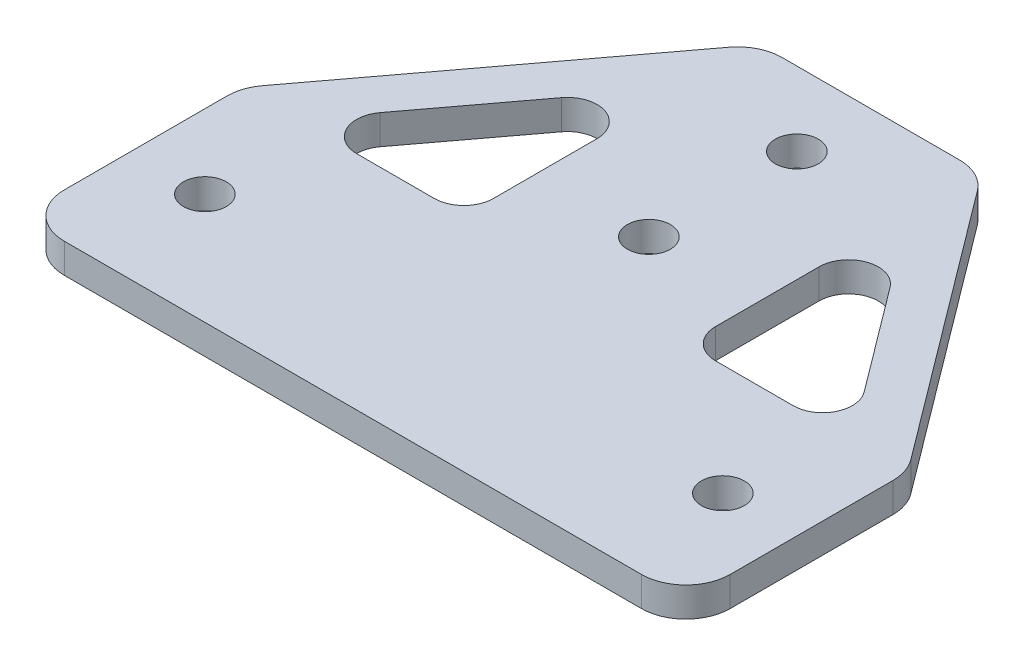
ISO-10303-21;
HEADER;
FILE_DESCRIPTION(('STEP AP214'),'2;1');
FILE_NAME('part.step','',(''),(''),'','','');
FILE_SCHEMA(('AUTOMOTIVE_DESIGN { 1 0 10303 214 1 1 1 1 }'));
ENDSEC;
DATA;
#1=APPLICATION_CONTEXT('core data for automotive mechanical design processes');
#2=APPLICATION_PROTOCOL_DEFINITION('international standard','automotive_design',2000,#1);
#3=PRODUCT_CONTEXT('',#1,'mechanical');
#4=PRODUCT('Part','Part','',(#3));
#5=PRODUCT_RELATED_PRODUCT_CATEGORY('part','',(#4));
#6=PRODUCT_DEFINITION_FORMATION('','',#4);
#7=PRODUCT_DEFINITION_CONTEXT('part definition',#1,'design');
#8=PRODUCT_DEFINITION('design','',#6,#7);
#9=PRODUCT_DEFINITION_SHAPE('','',#8);
#10=(LENGTH_UNIT() NAMED_UNIT(*) SI_UNIT(.MILLI.,.METRE.));
#11=(NAMED_UNIT(*) PLANE_ANGLE_UNIT() SI_UNIT($,.RADIAN.));
#12=(NAMED_UNIT(*) SI_UNIT($,.STERADIAN.) SOLID_ANGLE_UNIT());
#13=UNCERTAINTY_MEASURE_WITH_UNIT(LENGTH_MEASURE(1.E-05),#10,'distance_accuracy_value','');
#14=(GEOMETRIC_REPRESENTATION_CONTEXT(3) GLOBAL_UNCERTAINTY_ASSIGNED_CONTEXT((#13)) GLOBAL_UNIT_ASSIGNED_CONTEXT((#10,
#11,#12)) REPRESENTATION_CONTEXT('',''));
#15=CARTESIAN_POINT('',(0.,0.,0.));
#16=DIRECTION('',(0.,0.,1.));
#17=DIRECTION('',(1.,0.,0.));
#18=AXIS2_PLACEMENT_3D('',#15,#16,#17);
#19=CARTESIAN_POINT('',(0.,2.,0.));
#20=DIRECTION('',(0.,1.,0.));
#21=DIRECTION('',(0.,0.,1.));
#22=AXIS2_PLACEMENT_3D('',#19,#20,#21);
#23=PLANE('',#22);
#24=CARTESIAN_POINT('',(0.,2.,-12.5));
#25=DIRECTION('',(0.,1.,0.));
#26=DIRECTION('',(0.,0.,1.));
#27=AXIS2_PLACEMENT_3D('',#24,#25,#26);
#28=CIRCLE('',#27,1.45);
#29=CARTESIAN_POINT('',(0.,2.,-11.05));
#30=VERTEX_POINT('',#29);
#31=EDGE_CURVE('E386',#30,#30,#28,.T.);
#32=ORIENTED_EDGE('',*,*,#31,.F.);
#33=EDGE_LOOP('',(#32));
#34=FACE_BOUND('',#33,.T.);
#35=CARTESIAN_POINT('',(-17.5,2.,0.));
#36=DIRECTION('',(0.,1.,0.));
#37=DIRECTION('',(0.,0.,1.));
#38=AXIS2_PLACEMENT_3D('',#35,#36,#37);
#39=CIRCLE('',#38,1.45);
#40=CARTESIAN_POINT('',(-17.5,2.,1.45));
#41=VERTEX_POINT('',#40);
#42=EDGE_CURVE('E231',#41,#41,#39,.T.);
#43=ORIENTED_EDGE('',*,*,#42,.F.);
#44=EDGE_LOOP('',(#43));
#45=FACE_BOUND('',#44,.T.);
#46=DIRECTION('',(0.,0.,-1.));
#47=VECTOR('',#46,1.);
#48=CARTESIAN_POINT('',(22.5,2.,7.5));
#49=LINE('',#48,#47);
#50=CARTESIAN_POINT('',(22.5,2.,4.5));
#51=VERTEX_POINT('',#50);
#52=CARTESIAN_POINT('',(22.5,2.,-6.5));
#53=VERTEX_POINT('',#52);
#54=EDGE_CURVE('E240',#51,#53,#49,.T.);
#55=ORIENTED_EDGE('',*,*,#54,.T.);
#56=CARTESIAN_POINT('',(19.5,2.,-6.5));
#57=DIRECTION('',(0.,1.,0.));
#58=DIRECTION('',(0.,0.,1.));
#59=AXIS2_PLACEMENT_3D('',#56,#57,#58);
#60=CIRCLE('',#59,3.);
#61=CARTESIAN_POINT('',(21.9,2.,-8.3));
#62=VERTEX_POINT('',#61);
#63=EDGE_CURVE('E275',#53,#62,#60,.T.);
#64=ORIENTED_EDGE('',*,*,#63,.T.);
#65=DIRECTION('',(-0.6,0.,-0.8));
#66=VECTOR('',#65,1.);
#67=CARTESIAN_POINT('',(22.5,2.,-7.5));
#68=LINE('',#67,#66);
#69=CARTESIAN_POINT('',(8.40000000000001,2.,-26.3));
#70=VERTEX_POINT('',#69);
#71=EDGE_CURVE('E223',#62,#70,#68,.T.);
#72=ORIENTED_EDGE('',*,*,#71,.T.);
#73=CARTESIAN_POINT('',(6.00000000000001,2.,-24.5));
#74=DIRECTION('',(0.,1.,0.));
#75=DIRECTION('',(0.,0.,1.));
#76=AXIS2_PLACEMENT_3D('',#73,#74,#75);
#77=CIRCLE('',#76,3.);
#78=CARTESIAN_POINT('',(6.00000000000001,2.,-27.5));
#79=VERTEX_POINT('',#78);
#80=EDGE_CURVE('E265',#70,#79,#77,.T.);
#81=ORIENTED_EDGE('',*,*,#80,.T.);
#82=DIRECTION('',(-1.,0.,0.));
#83=VECTOR('',#82,1.);
#84=CARTESIAN_POINT('',(7.50000000000001,2.,-27.5));
#85=LINE('',#84,#83);
#86=CARTESIAN_POINT('',(-6.,2.,-27.5));
#87=VERTEX_POINT('',#86);
#88=EDGE_CURVE('E400',#79,#87,#85,.T.);
#89=ORIENTED_EDGE('',*,*,#88,.T.);
#90=CARTESIAN_POINT('',(-6.,2.,-24.5));
#91=DIRECTION('',(0.,1.,0.));
#92=DIRECTION('',(0.,0.,1.));
#93=AXIS2_PLACEMENT_3D('',#90,#91,#92);
#94=CIRCLE('',#93,3.);
#95=CARTESIAN_POINT('',(-8.4,2.,-26.3));
#96=VERTEX_POINT('',#95);
#97=EDGE_CURVE('E267',#87,#96,#94,.T.);
#98=ORIENTED_EDGE('',*,*,#97,.T.);
#99=DIRECTION('',(-0.6,0.,0.8));
#100=VECTOR('',#99,1.);
#101=CARTESIAN_POINT('',(-7.5,2.,-27.5));
#102=LINE('',#101,#100);
#103=CARTESIAN_POINT('',(-21.9,2.,-8.3));
#104=VERTEX_POINT('',#103);
#105=EDGE_CURVE('E403',#96,#104,#102,.T.);
#106=ORIENTED_EDGE('',*,*,#105,.T.);
#107=CARTESIAN_POINT('',(-19.5,2.,-6.5));
#108=DIRECTION('',(0.,1.,0.));
#109=DIRECTION('',(0.,0.,1.));
#110=AXIS2_PLACEMENT_3D('',#107,#108,#109);
#111=CIRCLE('',#110,3.);
#112=CARTESIAN_POINT('',(-22.5,2.,-6.5));
#113=VERTEX_POINT('',#112);
#114=EDGE_CURVE('E269',#104,#113,#111,.T.);
#115=ORIENTED_EDGE('',*,*,#114,.T.);
#116=DIRECTION('',(0.,0.,1.));
#117=VECTOR('',#116,1.);
#118=CARTESIAN_POINT('',(-22.5,2.,-7.5));
#119=LINE('',#118,#117);
#120=CARTESIAN_POINT('',(-22.5,2.,4.5));
#121=VERTEX_POINT('',#120);
#122=EDGE_CURVE('E406',#113,#121,#119,.T.);
#123=ORIENTED_EDGE('',*,*,#122,.T.);
#124=CARTESIAN_POINT('',(-19.5,2.,4.5));
#125=DIRECTION('',(0.,1.,0.));
#126=DIRECTION('',(0.,0.,1.));
#127=AXIS2_PLACEMENT_3D('',#124,#125,#126);
#128=CIRCLE('',#127,3.);
#129=CARTESIAN_POINT('',(-19.5,2.,7.5));
#130=VERTEX_POINT('',#129);
#131=EDGE_CURVE('E271',#121,#130,#128,.T.);
#132=ORIENTED_EDGE('',*,*,#131,.T.);
#133=DIRECTION('',(1.,0.,0.));
#134=VECTOR('',#133,1.);
#135=CARTESIAN_POINT('',(-22.5,2.,7.5));
#136=LINE('',#135,#134);
#137=CARTESIAN_POINT('',(19.5,2.,7.5));
#138=VERTEX_POINT('',#137);
#139=EDGE_CURVE('E408',#130,#138,#136,.T.);
#140=ORIENTED_EDGE('',*,*,#139,.T.);
#141=CARTESIAN_POINT('',(19.5,2.,4.5));
#142=DIRECTION('',(0.,1.,0.));
#143=DIRECTION('',(0.,0.,1.));
#144=AXIS2_PLACEMENT_3D('',#141,#142,#143);
#145=CIRCLE('',#144,3.);
#146=EDGE_CURVE('E273',#138,#51,#145,.T.);
#147=ORIENTED_EDGE('',*,*,#146,.T.);
#148=EDGE_LOOP('',(#55,#64,#72,#81,#89,#98,#106,#115,#123,#132,#140,#147));
#149=FACE_BOUND('',#148,.T.);
#150=CARTESIAN_POINT('',(17.5,2.,0.));
#151=DIRECTION('',(0.,1.,0.));
#152=DIRECTION('',(0.,0.,1.));
#153=AXIS2_PLACEMENT_3D('',#150,#151,#152);
#154=CIRCLE('',#153,1.45);
#155=CARTESIAN_POINT('',(17.5,2.,1.45));
#156=VERTEX_POINT('',#155);
#157=EDGE_CURVE('E392',#156,#156,#154,.T.);
#158=ORIENTED_EDGE('',*,*,#157,.F.);
#159=EDGE_LOOP('',(#158));
#160=FACE_BOUND('',#159,.T.);
#161=CARTESIAN_POINT('',(0.,2.,-22.5));
#162=DIRECTION('',(0.,1.,0.));
#163=DIRECTION('',(0.,0.,1.));
#164=AXIS2_PLACEMENT_3D('',#161,#162,#163);
#165=CIRCLE('',#164,1.45);
#166=CARTESIAN_POINT('',(0.,2.,-21.05));
#167=VERTEX_POINT('',#166);
#168=EDGE_CURVE('E380',#167,#167,#165,.T.);
#169=ORIENTED_EDGE('',*,*,#168,.F.);
#170=EDGE_LOOP('',(#169));
#171=FACE_BOUND('',#170,.T.);
#172=DIRECTION('',(-0.6,0.,0.8));
#173=VECTOR('',#172,1.);
#174=CARTESIAN_POINT('',(-7.5,2.,-22.5));
#175=LINE('',#174,#173);
#176=CARTESIAN_POINT('',(-11.1,2.,-17.7));
#177=VERTEX_POINT('',#176);
#178=CARTESIAN_POINT('',(-16.35,2.,-10.7));
#179=VERTEX_POINT('',#178);
#180=EDGE_CURVE('E363',#177,#179,#175,.T.);
#181=ORIENTED_EDGE('',*,*,#180,.F.);
#182=CARTESIAN_POINT('',(-9.5,2.,-16.5));
#183=DIRECTION('',(0.,1.,0.));
#184=DIRECTION('',(0.,0.,1.));
#185=AXIS2_PLACEMENT_3D('',#182,#183,#184);
#186=CIRCLE('',#185,2.);
#187=CARTESIAN_POINT('',(-7.5,2.,-16.5));
#188=VERTEX_POINT('',#187);
#189=EDGE_CURVE('E11',#177,#188,#186,.F.);
#190=ORIENTED_EDGE('',*,*,#189,.T.);
#191=DIRECTION('',(0.,0.,-1.));
#192=VECTOR('',#191,1.);
#193=CARTESIAN_POINT('',(-7.5,2.,-7.5));
#194=LINE('',#193,#192);
#195=CARTESIAN_POINT('',(-7.5,2.,-9.5));
#196=VERTEX_POINT('',#195);
#197=EDGE_CURVE('E361',#196,#188,#194,.T.);
#198=ORIENTED_EDGE('',*,*,#197,.F.);
#199=CARTESIAN_POINT('',(-9.5,2.,-9.5));
#200=DIRECTION('',(0.,1.,0.));
#201=DIRECTION('',(0.,0.,1.));
#202=AXIS2_PLACEMENT_3D('',#199,#200,#201);
#203=CIRCLE('',#202,2.);
#204=CARTESIAN_POINT('',(-9.5,2.,-7.5));
#205=VERTEX_POINT('',#204);
#206=EDGE_CURVE('E340',#196,#205,#203,.F.);
#207=ORIENTED_EDGE('',*,*,#206,.T.);
#208=DIRECTION('',(1.,0.,0.));
#209=VECTOR('',#208,1.);
#210=CARTESIAN_POINT('',(-18.75,2.,-7.5));
#211=LINE('',#210,#209);
#212=CARTESIAN_POINT('',(-14.75,2.,-7.5));
#213=VERTEX_POINT('',#212);
#214=EDGE_CURVE('E368',#213,#205,#211,.T.);
#215=ORIENTED_EDGE('',*,*,#214,.F.);
#216=CARTESIAN_POINT('',(-14.75,2.,-9.5));
#217=DIRECTION('',(0.,1.,0.));
#218=DIRECTION('',(0.,0.,1.));
#219=AXIS2_PLACEMENT_3D('',#216,#217,#218);
#220=CIRCLE('',#219,2.);
#221=EDGE_CURVE('E56',#213,#179,#220,.F.);
#222=ORIENTED_EDGE('',*,*,#221,.T.);
#223=EDGE_LOOP('',(#181,#190,#198,#207,#215,#222));
#224=FACE_BOUND('',#223,.T.);
#225=DIRECTION('',(0.,0.,1.));
#226=VECTOR('',#225,1.);
#227=CARTESIAN_POINT('',(7.50000000000001,2.,-7.5));
#228=LINE('',#227,#226);
#229=CARTESIAN_POINT('',(7.5,2.,-16.5));
#230=VERTEX_POINT('',#229);
#231=CARTESIAN_POINT('',(7.50000000000001,2.,-9.5));
#232=VERTEX_POINT('',#231);
#233=EDGE_CURVE('E621',#230,#232,#228,.T.);
#234=ORIENTED_EDGE('',*,*,#233,.F.);
#235=CARTESIAN_POINT('',(9.5,2.,-16.5));
#236=DIRECTION('',(0.,1.,0.));
#237=DIRECTION('',(0.,0.,1.));
#238=AXIS2_PLACEMENT_3D('',#235,#236,#237);
#239=CIRCLE('',#238,2.);
#240=CARTESIAN_POINT('',(11.1,2.,-17.7));
#241=VERTEX_POINT('',#240);
#242=EDGE_CURVE('E336',#230,#241,#239,.F.);
#243=ORIENTED_EDGE('',*,*,#242,.T.);
#244=DIRECTION('',(-0.6,0.,-0.8));
#245=VECTOR('',#244,1.);
#246=CARTESIAN_POINT('',(7.5,2.,-22.5));
#247=LINE('',#246,#245);
#248=CARTESIAN_POINT('',(16.35,2.,-10.7));
#249=VERTEX_POINT('',#248);
#250=EDGE_CURVE('E618',#249,#241,#247,.T.);
#251=ORIENTED_EDGE('',*,*,#250,.F.);
#252=CARTESIAN_POINT('',(14.75,2.,-9.5));
#253=DIRECTION('',(0.,1.,0.));
#254=DIRECTION('',(0.,0.,1.));
#255=AXIS2_PLACEMENT_3D('',#252,#253,#254);
#256=CIRCLE('',#255,2.);
#257=CARTESIAN_POINT('',(14.75,2.,-7.5));
#258=VERTEX_POINT('',#257);
#259=EDGE_CURVE('E332',#249,#258,#256,.F.);
#260=ORIENTED_EDGE('',*,*,#259,.T.);
#261=DIRECTION('',(1.,0.,0.));
#262=VECTOR('',#261,1.);
#263=CARTESIAN_POINT('',(18.75,2.,-7.5));
#264=LINE('',#263,#262);
#265=CARTESIAN_POINT('',(9.50000000000001,2.,-7.5));
#266=VERTEX_POINT('',#265);
#267=EDGE_CURVE('E378',#266,#258,#264,.T.);
#268=ORIENTED_EDGE('',*,*,#267,.F.);
#269=CARTESIAN_POINT('',(9.50000000000001,2.,-9.5));
#270=DIRECTION('',(0.,1.,0.));
#271=DIRECTION('',(0.,0.,1.));
#272=AXIS2_PLACEMENT_3D('',#269,#270,#271);
#273=CIRCLE('',#272,2.);
#274=EDGE_CURVE('E328',#266,#232,#273,.F.);
#275=ORIENTED_EDGE('',*,*,#274,.T.);
#276=EDGE_LOOP('',(#234,#243,#251,#260,#268,#275));
#277=FACE_BOUND('',#276,.T.);
#278=ADVANCED_FACE('F41',(#34,#45,#149,#160,#171,#224,#277),#23,.T.);
#279=CARTESIAN_POINT('',(0.,0.,0.));
#280=DIRECTION('',(0.,1.,0.));
#281=DIRECTION('',(0.,0.,1.));
#282=AXIS2_PLACEMENT_3D('',#279,#280,#281);
#283=PLANE('',#282);
#284=DIRECTION('',(1.,0.,0.));
#285=VECTOR('',#284,1.);
#286=CARTESIAN_POINT('',(-18.75,0.,-7.5));
#287=LINE('',#286,#285);
#288=CARTESIAN_POINT('',(-14.75,0.,-7.5));
#289=VERTEX_POINT('',#288);
#290=CARTESIAN_POINT('',(-9.5,0.,-7.5));
#291=VERTEX_POINT('',#290);
#292=EDGE_CURVE('E355',#289,#291,#287,.T.);
#293=ORIENTED_EDGE('',*,*,#292,.T.);
#294=CARTESIAN_POINT('',(-9.5,0.,-9.5));
#295=DIRECTION('',(0.,1.,0.));
#296=DIRECTION('',(0.,0.,1.));
#297=AXIS2_PLACEMENT_3D('',#294,#295,#296);
#298=CIRCLE('',#297,2.);
#299=CARTESIAN_POINT('',(-7.5,0.,-9.5));
#300=VERTEX_POINT('',#299);
#301=EDGE_CURVE('E338',#291,#300,#298,.T.);
#302=ORIENTED_EDGE('',*,*,#301,.T.);
#303=DIRECTION('',(0.,0.,-1.));
#304=VECTOR('',#303,1.);
#305=CARTESIAN_POINT('',(-7.5,0.,-7.5));
#306=LINE('',#305,#304);
#307=CARTESIAN_POINT('',(-7.5,0.,-16.5));
#308=VERTEX_POINT('',#307);
#309=EDGE_CURVE('E350',#300,#308,#306,.T.);
#310=ORIENTED_EDGE('',*,*,#309,.T.);
#311=CARTESIAN_POINT('',(-9.5,0.,-16.5));
#312=DIRECTION('',(0.,1.,0.));
#313=DIRECTION('',(0.,0.,1.));
#314=AXIS2_PLACEMENT_3D('',#311,#312,#313);
#315=CIRCLE('',#314,2.);
#316=CARTESIAN_POINT('',(-11.1,0.,-17.7));
#317=VERTEX_POINT('',#316);
#318=EDGE_CURVE('E49',#308,#317,#315,.T.);
#319=ORIENTED_EDGE('',*,*,#318,.T.);
#320=DIRECTION('',(-0.6,0.,0.8));
#321=VECTOR('',#320,1.);
#322=CARTESIAN_POINT('',(-7.5,0.,-22.5));
#323=LINE('',#322,#321);
#324=CARTESIAN_POINT('',(-16.35,0.,-10.7));
#325=VERTEX_POINT('',#324);
#326=EDGE_CURVE('E348',#317,#325,#323,.T.);
#327=ORIENTED_EDGE('',*,*,#326,.T.);
#328=CARTESIAN_POINT('',(-14.75,0.,-9.5));
#329=DIRECTION('',(0.,1.,0.));
#330=DIRECTION('',(0.,0.,1.));
#331=AXIS2_PLACEMENT_3D('',#328,#329,#330);
#332=CIRCLE('',#331,2.);
#333=EDGE_CURVE('E342',#325,#289,#332,.T.);
#334=ORIENTED_EDGE('',*,*,#333,.T.);
#335=EDGE_LOOP('',(#293,#302,#310,#319,#327,#334));
#336=FACE_BOUND('',#335,.T.);
#337=DIRECTION('',(-0.6,0.,-0.8));
#338=VECTOR('',#337,1.);
#339=CARTESIAN_POINT('',(22.5,0.,-7.5));
#340=LINE('',#339,#338);
#341=CARTESIAN_POINT('',(21.9,0.,-8.3));
#342=VERTEX_POINT('',#341);
#343=CARTESIAN_POINT('',(8.40000000000001,0.,-26.3));
#344=VERTEX_POINT('',#343);
#345=EDGE_CURVE('E220',#342,#344,#340,.T.);
#346=ORIENTED_EDGE('',*,*,#345,.F.);
#347=CARTESIAN_POINT('',(19.5,0.,-6.5));
#348=DIRECTION('',(0.,1.,0.));
#349=DIRECTION('',(0.,0.,1.));
#350=AXIS2_PLACEMENT_3D('',#347,#348,#349);
#351=CIRCLE('',#350,3.);
#352=CARTESIAN_POINT('',(22.5,0.,-6.5));
#353=VERTEX_POINT('',#352);
#354=EDGE_CURVE('E203',#342,#353,#351,.F.);
#355=ORIENTED_EDGE('',*,*,#354,.T.);
#356=DIRECTION('',(0.,0.,-1.));
#357=VECTOR('',#356,1.);
#358=CARTESIAN_POINT('',(22.5,0.,7.5));
#359=LINE('',#358,#357);
#360=CARTESIAN_POINT('',(22.5,0.,4.5));
#361=VERTEX_POINT('',#360);
#362=EDGE_CURVE('E251',#361,#353,#359,.T.);
#363=ORIENTED_EDGE('',*,*,#362,.F.);
#364=CARTESIAN_POINT('',(19.5,0.,4.5));
#365=DIRECTION('',(0.,1.,0.));
#366=DIRECTION('',(0.,0.,1.));
#367=AXIS2_PLACEMENT_3D('',#364,#365,#366);
#368=CIRCLE('',#367,3.);
#369=CARTESIAN_POINT('',(19.5,0.,7.5));
#370=VERTEX_POINT('',#369);
#371=EDGE_CURVE('E214',#361,#370,#368,.F.);
#372=ORIENTED_EDGE('',*,*,#371,.T.);
#373=DIRECTION('',(1.,0.,0.));
#374=VECTOR('',#373,1.);
#375=CARTESIAN_POINT('',(-22.5,0.,7.5));
#376=LINE('',#375,#374);
#377=CARTESIAN_POINT('',(-19.5,0.,7.5));
#378=VERTEX_POINT('',#377);
#379=EDGE_CURVE('E248',#378,#370,#376,.T.);
#380=ORIENTED_EDGE('',*,*,#379,.F.);
#381=CARTESIAN_POINT('',(-19.5,0.,4.5));
#382=DIRECTION('',(0.,1.,0.));
#383=DIRECTION('',(0.,0.,1.));
#384=AXIS2_PLACEMENT_3D('',#381,#382,#383);
#385=CIRCLE('',#384,3.);
#386=CARTESIAN_POINT('',(-22.5,0.,4.5));
#387=VERTEX_POINT('',#386);
#388=EDGE_CURVE('E259',#378,#387,#385,.F.);
#389=ORIENTED_EDGE('',*,*,#388,.T.);
#390=DIRECTION('',(0.,0.,1.));
#391=VECTOR('',#390,1.);
#392=CARTESIAN_POINT('',(-22.5,0.,-7.5));
#393=LINE('',#392,#391);
#394=CARTESIAN_POINT('',(-22.5,0.,-6.5));
#395=VERTEX_POINT('',#394);
#396=EDGE_CURVE('E245',#395,#387,#393,.T.);
#397=ORIENTED_EDGE('',*,*,#396,.F.);
#398=CARTESIAN_POINT('',(-19.5,0.,-6.5));
#399=DIRECTION('',(0.,1.,0.));
#400=DIRECTION('',(0.,0.,1.));
#401=AXIS2_PLACEMENT_3D('',#398,#399,#400);
#402=CIRCLE('',#401,3.);
#403=CARTESIAN_POINT('',(-21.9,0.,-8.3));
#404=VERTEX_POINT('',#403);
#405=EDGE_CURVE('E257',#395,#404,#402,.F.);
#406=ORIENTED_EDGE('',*,*,#405,.T.);
#407=DIRECTION('',(-0.6,0.,0.8));
#408=VECTOR('',#407,1.);
#409=CARTESIAN_POINT('',(-7.5,0.,-27.5));
#410=LINE('',#409,#408);
#411=CARTESIAN_POINT('',(-8.4,0.,-26.3));
#412=VERTEX_POINT('',#411);
#413=EDGE_CURVE('E234',#412,#404,#410,.T.);
#414=ORIENTED_EDGE('',*,*,#413,.F.);
#415=CARTESIAN_POINT('',(-6.,0.,-24.5));
#416=DIRECTION('',(0.,1.,0.));
#417=DIRECTION('',(0.,0.,1.));
#418=AXIS2_PLACEMENT_3D('',#415,#416,#417);
#419=CIRCLE('',#418,3.);
#420=CARTESIAN_POINT('',(-6.,0.,-27.5));
#421=VERTEX_POINT('',#420);
#422=EDGE_CURVE('E255',#412,#421,#419,.F.);
#423=ORIENTED_EDGE('',*,*,#422,.T.);
#424=DIRECTION('',(-1.,0.,0.));
#425=VECTOR('',#424,1.);
#426=CARTESIAN_POINT('',(7.50000000000001,0.,-27.5));
#427=LINE('',#426,#425);
#428=CARTESIAN_POINT('',(6.00000000000001,0.,-27.5));
#429=VERTEX_POINT('',#428);
#430=EDGE_CURVE('E230',#429,#421,#427,.T.);
#431=ORIENTED_EDGE('',*,*,#430,.F.);
#432=CARTESIAN_POINT('',(6.00000000000001,0.,-24.5));
#433=DIRECTION('',(0.,1.,0.));
#434=DIRECTION('',(0.,0.,1.));
#435=AXIS2_PLACEMENT_3D('',#432,#433,#434);
#436=CIRCLE('',#435,3.);
#437=EDGE_CURVE('E224',#429,#344,#436,.F.);
#438=ORIENTED_EDGE('',*,*,#437,.T.);
#439=EDGE_LOOP('',(#346,#355,#363,#372,#380,#389,#397,#406,#414,#423,#431,#438));
#440=FACE_BOUND('',#439,.T.);
#441=CARTESIAN_POINT('',(-17.5,0.,0.));
#442=DIRECTION('',(0.,1.,0.));
#443=DIRECTION('',(0.,0.,1.));
#444=AXIS2_PLACEMENT_3D('',#441,#442,#443);
#445=CIRCLE('',#444,1.45);
#446=CARTESIAN_POINT('',(-17.5,0.,1.45));
#447=VERTEX_POINT('',#446);
#448=EDGE_CURVE('E237',#447,#447,#445,.T.);
#449=ORIENTED_EDGE('',*,*,#448,.T.);
#450=EDGE_LOOP('',(#449));
#451=FACE_BOUND('',#450,.T.);
#452=CARTESIAN_POINT('',(17.5,0.,0.));
#453=DIRECTION('',(0.,1.,0.));
#454=DIRECTION('',(0.,0.,1.));
#455=AXIS2_PLACEMENT_3D('',#452,#453,#454);
#456=CIRCLE('',#455,1.45);
#457=CARTESIAN_POINT('',(17.5,0.,1.45));
#458=VERTEX_POINT('',#457);
#459=EDGE_CURVE('E389',#458,#458,#456,.T.);
#460=ORIENTED_EDGE('',*,*,#459,.T.);
#461=EDGE_LOOP('',(#460));
#462=FACE_BOUND('',#461,.T.);
#463=CARTESIAN_POINT('',(0.,0.,-12.5));
#464=DIRECTION('',(0.,1.,0.));
#465=DIRECTION('',(0.,0.,1.));
#466=AXIS2_PLACEMENT_3D('',#463,#464,#465);
#467=CIRCLE('',#466,1.45);
#468=CARTESIAN_POINT('',(0.,0.,-11.05));
#469=VERTEX_POINT('',#468);
#470=EDGE_CURVE('E383',#469,#469,#467,.T.);
#471=ORIENTED_EDGE('',*,*,#470,.T.);
#472=EDGE_LOOP('',(#471));
#473=FACE_BOUND('',#472,.T.);
#474=CARTESIAN_POINT('',(0.,0.,-22.5));
#475=DIRECTION('',(0.,1.,0.));
#476=DIRECTION('',(0.,0.,1.));
#477=AXIS2_PLACEMENT_3D('',#474,#475,#476);
#478=CIRCLE('',#477,1.45);
#479=CARTESIAN_POINT('',(0.,0.,-21.05));
#480=VERTEX_POINT('',#479);
#481=EDGE_CURVE('E377',#480,#480,#478,.T.);
#482=ORIENTED_EDGE('',*,*,#481,.T.);
#483=EDGE_LOOP('',(#482));
#484=FACE_BOUND('',#483,.T.);
#485=DIRECTION('',(1.,0.,0.));
#486=VECTOR('',#485,1.);
#487=CARTESIAN_POINT('',(18.75,0.,-7.5));
#488=LINE('',#487,#486);
#489=CARTESIAN_POINT('',(9.50000000000001,0.,-7.5));
#490=VERTEX_POINT('',#489);
#491=CARTESIAN_POINT('',(14.75,0.,-7.5));
#492=VERTEX_POINT('',#491);
#493=EDGE_CURVE('E372',#490,#492,#488,.T.);
#494=ORIENTED_EDGE('',*,*,#493,.T.);
#495=CARTESIAN_POINT('',(14.75,0.,-9.5));
#496=DIRECTION('',(0.,1.,0.));
#497=DIRECTION('',(0.,0.,1.));
#498=AXIS2_PLACEMENT_3D('',#495,#496,#497);
#499=CIRCLE('',#498,2.);
#500=CARTESIAN_POINT('',(16.35,0.,-10.7));
#501=VERTEX_POINT('',#500);
#502=EDGE_CURVE('E330',#492,#501,#499,.T.);
#503=ORIENTED_EDGE('',*,*,#502,.T.);
#504=DIRECTION('',(-0.6,0.,-0.8));
#505=VECTOR('',#504,1.);
#506=CARTESIAN_POINT('',(7.5,0.,-22.5));
#507=LINE('',#506,#505);
#508=CARTESIAN_POINT('',(11.1,0.,-17.7));
#509=VERTEX_POINT('',#508);
#510=EDGE_CURVE('E623',#501,#509,#507,.T.);
#511=ORIENTED_EDGE('',*,*,#510,.T.);
#512=CARTESIAN_POINT('',(9.5,0.,-16.5));
#513=DIRECTION('',(0.,1.,0.));
#514=DIRECTION('',(0.,0.,1.));
#515=AXIS2_PLACEMENT_3D('',#512,#513,#514);
#516=CIRCLE('',#515,2.);
#517=CARTESIAN_POINT('',(7.5,0.,-16.5));
#518=VERTEX_POINT('',#517);
#519=EDGE_CURVE('E334',#509,#518,#516,.T.);
#520=ORIENTED_EDGE('',*,*,#519,.T.);
#521=DIRECTION('',(0.,0.,1.));
#522=VECTOR('',#521,1.);
#523=CARTESIAN_POINT('',(7.50000000000001,0.,-7.5));
#524=LINE('',#523,#522);
#525=CARTESIAN_POINT('',(7.50000000000001,0.,-9.5));
#526=VERTEX_POINT('',#525);
#527=EDGE_CURVE('E619',#518,#526,#524,.T.);
#528=ORIENTED_EDGE('',*,*,#527,.T.);
#529=CARTESIAN_POINT('',(9.50000000000001,0.,-9.5));
#530=DIRECTION('',(0.,1.,0.));
#531=DIRECTION('',(0.,0.,1.));
#532=AXIS2_PLACEMENT_3D('',#529,#530,#531);
#533=CIRCLE('',#532,2.);
#534=EDGE_CURVE('E326',#526,#490,#533,.T.);
#535=ORIENTED_EDGE('',*,*,#534,.T.);
#536=EDGE_LOOP('',(#494,#503,#511,#520,#528,#535));
#537=FACE_BOUND('',#536,.T.);
#538=ADVANCED_FACE('F227',(#336,#440,#451,#462,#473,#484,#537),#283,.F.);
#539=CARTESIAN_POINT('',(22.5,2.,-7.5));
#540=DIRECTION('',(-0.8,0.,0.6));
#541=DIRECTION('',(0.6,0.,0.8));
#542=AXIS2_PLACEMENT_3D('',#539,#540,#541);
#543=PLANE('',#542);
#544=ORIENTED_EDGE('',*,*,#71,.F.);
#545=DIRECTION('',(0.,-1.,0.));
#546=VECTOR('',#545,1.);
#547=CARTESIAN_POINT('',(21.9,2.,-8.3));
#548=LINE('',#547,#546);
#549=EDGE_CURVE('E207',#62,#342,#548,.T.);
#550=ORIENTED_EDGE('',*,*,#549,.T.);
#551=ORIENTED_EDGE('',*,*,#345,.T.);
#552=DIRECTION('',(0.,-1.,0.));
#553=VECTOR('',#552,1.);
#554=CARTESIAN_POINT('',(8.40000000000001,2.,-26.3));
#555=LINE('',#554,#553);
#556=EDGE_CURVE('E225',#344,#70,#555,.F.);
#557=ORIENTED_EDGE('',*,*,#556,.T.);
#558=EDGE_LOOP('',(#544,#550,#551,#557));
#559=FACE_BOUND('',#558,.T.);
#560=ADVANCED_FACE('F219',(#559),#543,.F.);
#561=CARTESIAN_POINT('',(7.50000000000001,2.,-27.5));
#562=DIRECTION('',(0.,0.,1.));
#563=DIRECTION('',(1.,0.,0.));
#564=AXIS2_PLACEMENT_3D('',#561,#562,#563);
#565=PLANE('',#564);
#566=ORIENTED_EDGE('',*,*,#430,.T.);
#567=DIRECTION('',(0.,-1.,0.));
#568=VECTOR('',#567,1.);
#569=CARTESIAN_POINT('',(-6.,2.,-27.5));
#570=LINE('',#569,#568);
#571=EDGE_CURVE('E295',#421,#87,#570,.F.);
#572=ORIENTED_EDGE('',*,*,#571,.T.);
#573=ORIENTED_EDGE('',*,*,#88,.F.);
#574=DIRECTION('',(0.,-1.,0.));
#575=VECTOR('',#574,1.);
#576=CARTESIAN_POINT('',(6.00000000000001,2.,-27.5));
#577=LINE('',#576,#575);
#578=EDGE_CURVE('E292',#79,#429,#577,.T.);
#579=ORIENTED_EDGE('',*,*,#578,.T.);
#580=EDGE_LOOP('',(#566,#572,#573,#579));
#581=FACE_BOUND('',#580,.T.);
#582=ADVANCED_FACE('F449',(#581),#565,.F.);
#583=CARTESIAN_POINT('',(-7.5,2.,-27.5));
#584=DIRECTION('',(0.8,0.,0.6));
#585=DIRECTION('',(0.6,0.,-0.8));
#586=AXIS2_PLACEMENT_3D('',#583,#584,#585);
#587=PLANE('',#586);
#588=ORIENTED_EDGE('',*,*,#413,.T.);
#589=DIRECTION('',(0.,-1.,0.));
#590=VECTOR('',#589,1.);
#591=CARTESIAN_POINT('',(-21.9,2.,-8.3));
#592=LINE('',#591,#590);
#593=EDGE_CURVE('E290',#404,#104,#592,.F.);
#594=ORIENTED_EDGE('',*,*,#593,.T.);
#595=ORIENTED_EDGE('',*,*,#105,.F.);
#596=DIRECTION('',(0.,-1.,0.));
#597=VECTOR('',#596,1.);
#598=CARTESIAN_POINT('',(-8.4,2.,-26.3));
#599=LINE('',#598,#597);
#600=EDGE_CURVE('E287',#96,#412,#599,.T.);
#601=ORIENTED_EDGE('',*,*,#600,.T.);
#602=EDGE_LOOP('',(#588,#594,#595,#601));
#603=FACE_BOUND('',#602,.T.);
#604=ADVANCED_FACE('F441',(#603),#587,.F.);
#605=CARTESIAN_POINT('',(-22.5,2.,-7.5));
#606=DIRECTION('',(1.,0.,0.));
#607=DIRECTION('',(0.,0.,-1.));
#608=AXIS2_PLACEMENT_3D('',#605,#606,#607);
#609=PLANE('',#608);
#610=ORIENTED_EDGE('',*,*,#396,.T.);
#611=DIRECTION('',(0.,-1.,0.));
#612=VECTOR('',#611,1.);
#613=CARTESIAN_POINT('',(-22.5,2.,4.5));
#614=LINE('',#613,#612);
#615=EDGE_CURVE('E285',#387,#121,#614,.F.);
#616=ORIENTED_EDGE('',*,*,#615,.T.);
#617=ORIENTED_EDGE('',*,*,#122,.F.);
#618=DIRECTION('',(0.,-1.,0.));
#619=VECTOR('',#618,1.);
#620=CARTESIAN_POINT('',(-22.5,2.,-6.5));
#621=LINE('',#620,#619);
#622=EDGE_CURVE('E282',#113,#395,#621,.T.);
#623=ORIENTED_EDGE('',*,*,#622,.T.);
#624=EDGE_LOOP('',(#610,#616,#617,#623));
#625=FACE_BOUND('',#624,.T.);
#626=ADVANCED_FACE('F432',(#625),#609,.F.);
#627=CARTESIAN_POINT('',(-22.5,2.,7.5));
#628=DIRECTION('',(0.,0.,-1.));
#629=DIRECTION('',(-1.,0.,0.));
#630=AXIS2_PLACEMENT_3D('',#627,#628,#629);
#631=PLANE('',#630);
#632=ORIENTED_EDGE('',*,*,#379,.T.);
#633=DIRECTION('',(0.,-1.,0.));
#634=VECTOR('',#633,1.);
#635=CARTESIAN_POINT('',(19.5,2.,7.5));
#636=LINE('',#635,#634);
#637=EDGE_CURVE('E280',#370,#138,#636,.F.);
#638=ORIENTED_EDGE('',*,*,#637,.T.);
#639=ORIENTED_EDGE('',*,*,#139,.F.);
#640=DIRECTION('',(0.,-1.,0.));
#641=VECTOR('',#640,1.);
#642=CARTESIAN_POINT('',(-19.5,2.,7.5));
#643=LINE('',#642,#641);
#644=EDGE_CURVE('E277',#130,#378,#643,.T.);
#645=ORIENTED_EDGE('',*,*,#644,.T.);
#646=EDGE_LOOP('',(#632,#638,#639,#645));
#647=FACE_BOUND('',#646,.T.);
#648=ADVANCED_FACE('F424',(#647),#631,.F.);
#649=CARTESIAN_POINT('',(22.5,2.,7.5));
#650=DIRECTION('',(-1.,0.,0.));
#651=DIRECTION('',(0.,0.,1.));
#652=AXIS2_PLACEMENT_3D('',#649,#650,#651);
#653=PLANE('',#652);
#654=ORIENTED_EDGE('',*,*,#362,.T.);
#655=DIRECTION('',(0.,-1.,0.));
#656=VECTOR('',#655,1.);
#657=CARTESIAN_POINT('',(22.5,2.,-6.5));
#658=LINE('',#657,#656);
#659=EDGE_CURVE('E208',#353,#53,#658,.F.);
#660=ORIENTED_EDGE('',*,*,#659,.T.);
#661=ORIENTED_EDGE('',*,*,#54,.F.);
#662=DIRECTION('',(0.,-1.,0.));
#663=VECTOR('',#662,1.);
#664=CARTESIAN_POINT('',(22.5,2.,4.5));
#665=LINE('',#664,#663);
#666=EDGE_CURVE('E213',#51,#361,#665,.T.);
#667=ORIENTED_EDGE('',*,*,#666,.T.);
#668=EDGE_LOOP('',(#654,#660,#661,#667));
#669=FACE_BOUND('',#668,.T.);
#670=ADVANCED_FACE('F418',(#669),#653,.F.);
#671=CARTESIAN_POINT('',(-17.5,2.,0.));
#672=DIRECTION('',(0.,-1.,0.));
#673=DIRECTION('',(0.,0.,-1.));
#674=AXIS2_PLACEMENT_3D('',#671,#672,#673);
#675=CYLINDRICAL_SURFACE('',#674,1.45);
#676=ORIENTED_EDGE('',*,*,#42,.T.);
#677=EDGE_LOOP('',(#676));
#678=FACE_BOUND('',#677,.T.);
#679=ORIENTED_EDGE('',*,*,#448,.F.);
#680=EDGE_LOOP('',(#679));
#681=FACE_BOUND('',#680,.T.);
#682=ADVANCED_FACE('F476',(#678,#681),#675,.F.);
#683=CARTESIAN_POINT('',(17.5,2.,0.));
#684=DIRECTION('',(0.,-1.,0.));
#685=DIRECTION('',(0.,0.,-1.));
#686=AXIS2_PLACEMENT_3D('',#683,#684,#685);
#687=CYLINDRICAL_SURFACE('',#686,1.45);
#688=ORIENTED_EDGE('',*,*,#157,.T.);
#689=EDGE_LOOP('',(#688));
#690=FACE_BOUND('',#689,.T.);
#691=ORIENTED_EDGE('',*,*,#459,.F.);
#692=EDGE_LOOP('',(#691));
#693=FACE_BOUND('',#692,.T.);
#694=ADVANCED_FACE('F594',(#690,#693),#687,.F.);
#695=CARTESIAN_POINT('',(0.,2.,-12.5));
#696=DIRECTION('',(0.,-1.,0.));
#697=DIRECTION('',(0.,0.,-1.));
#698=AXIS2_PLACEMENT_3D('',#695,#696,#697);
#699=CYLINDRICAL_SURFACE('',#698,1.45);
#700=ORIENTED_EDGE('',*,*,#31,.T.);
#701=EDGE_LOOP('',(#700));
#702=FACE_BOUND('',#701,.T.);
#703=ORIENTED_EDGE('',*,*,#470,.F.);
#704=EDGE_LOOP('',(#703));
#705=FACE_BOUND('',#704,.T.);
#706=ADVANCED_FACE('F591',(#702,#705),#699,.F.);
#707=CARTESIAN_POINT('',(0.,2.,-22.5));
#708=DIRECTION('',(0.,-1.,0.));
#709=DIRECTION('',(0.,0.,-1.));
#710=AXIS2_PLACEMENT_3D('',#707,#708,#709);
#711=CYLINDRICAL_SURFACE('',#710,1.45);
#712=ORIENTED_EDGE('',*,*,#168,.T.);
#713=EDGE_LOOP('',(#712));
#714=FACE_BOUND('',#713,.T.);
#715=ORIENTED_EDGE('',*,*,#481,.F.);
#716=EDGE_LOOP('',(#715));
#717=FACE_BOUND('',#716,.T.);
#718=ADVANCED_FACE('F588',(#714,#717),#711,.F.);
#719=CARTESIAN_POINT('',(-7.5,2.,-7.5));
#720=DIRECTION('',(-1.,0.,0.));
#721=DIRECTION('',(0.,0.,1.));
#722=AXIS2_PLACEMENT_3D('',#719,#720,#721);
#723=PLANE('',#722);
#724=ORIENTED_EDGE('',*,*,#309,.F.);
#725=DIRECTION('',(0.,-1.,0.));
#726=VECTOR('',#725,1.);
#727=CARTESIAN_POINT('',(-7.5,2.,-9.5));
#728=LINE('',#727,#726);
#729=EDGE_CURVE('E320',#300,#196,#728,.F.);
#730=ORIENTED_EDGE('',*,*,#729,.T.);
#731=ORIENTED_EDGE('',*,*,#197,.T.);
#732=DIRECTION('',(0.,-1.,0.));
#733=VECTOR('',#732,1.);
#734=CARTESIAN_POINT('',(-7.5,0.,-16.5));
#735=LINE('',#734,#733);
#736=EDGE_CURVE('E317',#188,#308,#735,.T.);
#737=ORIENTED_EDGE('',*,*,#736,.T.);
#738=EDGE_LOOP('',(#724,#730,#731,#737));
#739=FACE_BOUND('',#738,.T.);
#740=ADVANCED_FACE('F365',(#739),#723,.T.);
#741=CARTESIAN_POINT('',(-7.5,2.,-22.5));
#742=DIRECTION('',(0.8,0.,0.6));
#743=DIRECTION('',(0.6,0.,-0.8));
#744=AXIS2_PLACEMENT_3D('',#741,#742,#743);
#745=PLANE('',#744);
#746=ORIENTED_EDGE('',*,*,#180,.T.);
#747=DIRECTION('',(0.,-1.,0.));
#748=VECTOR('',#747,1.);
#749=CARTESIAN_POINT('',(-16.35,0.,-10.7));
#750=LINE('',#749,#748);
#751=EDGE_CURVE('E323',#179,#325,#750,.T.);
#752=ORIENTED_EDGE('',*,*,#751,.T.);
#753=ORIENTED_EDGE('',*,*,#326,.F.);
#754=DIRECTION('',(0.,-1.,0.));
#755=VECTOR('',#754,1.);
#756=CARTESIAN_POINT('',(-11.1,2.,-17.7));
#757=LINE('',#756,#755);
#758=EDGE_CURVE('E63',#317,#177,#757,.F.);
#759=ORIENTED_EDGE('',*,*,#758,.T.);
#760=EDGE_LOOP('',(#746,#752,#753,#759));
#761=FACE_BOUND('',#760,.T.);
#762=ADVANCED_FACE('F353',(#761),#745,.T.);
#763=CARTESIAN_POINT('',(-18.75,2.,-7.5));
#764=DIRECTION('',(0.,0.,-1.));
#765=DIRECTION('',(-1.,0.,0.));
#766=AXIS2_PLACEMENT_3D('',#763,#764,#765);
#767=PLANE('',#766);
#768=ORIENTED_EDGE('',*,*,#214,.T.);
#769=DIRECTION('',(0.,-1.,0.));
#770=VECTOR('',#769,1.);
#771=CARTESIAN_POINT('',(-9.5,0.,-7.5));
#772=LINE('',#771,#770);
#773=EDGE_CURVE('E314',#205,#291,#772,.T.);
#774=ORIENTED_EDGE('',*,*,#773,.T.);
#775=ORIENTED_EDGE('',*,*,#292,.F.);
#776=DIRECTION('',(0.,-1.,0.));
#777=VECTOR('',#776,1.);
#778=CARTESIAN_POINT('',(-14.75,2.,-7.5));
#779=LINE('',#778,#777);
#780=EDGE_CURVE('E312',#289,#213,#779,.F.);
#781=ORIENTED_EDGE('',*,*,#780,.T.);
#782=EDGE_LOOP('',(#768,#774,#775,#781));
#783=FACE_BOUND('',#782,.T.);
#784=ADVANCED_FACE('F571',(#783),#767,.T.);
#785=CARTESIAN_POINT('',(7.5,2.,-22.5));
#786=DIRECTION('',(-0.8,0.,0.6));
#787=DIRECTION('',(0.6,0.,0.8));
#788=AXIS2_PLACEMENT_3D('',#785,#786,#787);
#789=PLANE('',#788);
#790=ORIENTED_EDGE('',*,*,#510,.F.);
#791=DIRECTION('',(0.,-1.,0.));
#792=VECTOR('',#791,1.);
#793=CARTESIAN_POINT('',(16.35,2.,-10.7));
#794=LINE('',#793,#792);
#795=EDGE_CURVE('E310',#501,#249,#794,.F.);
#796=ORIENTED_EDGE('',*,*,#795,.T.);
#797=ORIENTED_EDGE('',*,*,#250,.T.);
#798=DIRECTION('',(0.,-1.,0.));
#799=VECTOR('',#798,1.);
#800=CARTESIAN_POINT('',(11.1,0.,-17.7));
#801=LINE('',#800,#799);
#802=EDGE_CURVE('E307',#241,#509,#801,.T.);
#803=ORIENTED_EDGE('',*,*,#802,.T.);
#804=EDGE_LOOP('',(#790,#796,#797,#803));
#805=FACE_BOUND('',#804,.T.);
#806=ADVANCED_FACE('F574',(#805),#789,.T.);
#807=CARTESIAN_POINT('',(7.50000000000001,2.,-7.5));
#808=DIRECTION('',(1.,0.,0.));
#809=DIRECTION('',(0.,0.,-1.));
#810=AXIS2_PLACEMENT_3D('',#807,#808,#809);
#811=PLANE('',#810);
#812=ORIENTED_EDGE('',*,*,#233,.T.);
#813=DIRECTION('',(0.,-1.,0.));
#814=VECTOR('',#813,1.);
#815=CARTESIAN_POINT('',(7.50000000000001,0.,-9.5));
#816=LINE('',#815,#814);
#817=EDGE_CURVE('E299',#232,#526,#816,.T.);
#818=ORIENTED_EDGE('',*,*,#817,.T.);
#819=ORIENTED_EDGE('',*,*,#527,.F.);
#820=DIRECTION('',(0.,-1.,0.));
#821=VECTOR('',#820,1.);
#822=CARTESIAN_POINT('',(7.5,2.,-16.5));
#823=LINE('',#822,#821);
#824=EDGE_CURVE('E297',#518,#230,#823,.F.);
#825=ORIENTED_EDGE('',*,*,#824,.T.);
#826=EDGE_LOOP('',(#812,#818,#819,#825));
#827=FACE_BOUND('',#826,.T.);
#828=ADVANCED_FACE('F580',(#827),#811,.T.);
#829=CARTESIAN_POINT('',(18.75,2.,-7.5));
#830=DIRECTION('',(0.,0.,-1.));
#831=DIRECTION('',(-1.,0.,0.));
#832=AXIS2_PLACEMENT_3D('',#829,#830,#831);
#833=PLANE('',#832);
#834=ORIENTED_EDGE('',*,*,#493,.F.);
#835=DIRECTION('',(0.,-1.,0.));
#836=VECTOR('',#835,1.);
#837=CARTESIAN_POINT('',(9.50000000000001,2.,-7.5));
#838=LINE('',#837,#836);
#839=EDGE_CURVE('E305',#490,#266,#838,.F.);
#840=ORIENTED_EDGE('',*,*,#839,.T.);
#841=ORIENTED_EDGE('',*,*,#267,.T.);
#842=DIRECTION('',(0.,-1.,0.));
#843=VECTOR('',#842,1.);
#844=CARTESIAN_POINT('',(14.75,0.,-7.5));
#845=LINE('',#844,#843);
#846=EDGE_CURVE('E302',#258,#492,#845,.T.);
#847=ORIENTED_EDGE('',*,*,#846,.T.);
#848=EDGE_LOOP('',(#834,#840,#841,#847));
#849=FACE_BOUND('',#848,.T.);
#850=ADVANCED_FACE('F493',(#849),#833,.T.);
#851=CARTESIAN_POINT('',(19.5,2.,-6.5));
#852=DIRECTION('',(0.,-1.,0.));
#853=DIRECTION('',(0.,0.,-1.));
#854=AXIS2_PLACEMENT_3D('',#851,#852,#853);
#855=CYLINDRICAL_SURFACE('',#854,3.);
#856=ORIENTED_EDGE('',*,*,#63,.F.);
#857=ORIENTED_EDGE('',*,*,#659,.F.);
#858=ORIENTED_EDGE('',*,*,#354,.F.);
#859=ORIENTED_EDGE('',*,*,#549,.F.);
#860=EDGE_LOOP('',(#856,#857,#858,#859));
#861=FACE_BOUND('',#860,.T.);
#862=ADVANCED_FACE('F206',(#861),#855,.T.);
#863=CARTESIAN_POINT('',(19.5,2.,4.5));
#864=DIRECTION('',(0.,-1.,0.));
#865=DIRECTION('',(0.,0.,-1.));
#866=AXIS2_PLACEMENT_3D('',#863,#864,#865);
#867=CYLINDRICAL_SURFACE('',#866,3.);
#868=ORIENTED_EDGE('',*,*,#146,.F.);
#869=ORIENTED_EDGE('',*,*,#637,.F.);
#870=ORIENTED_EDGE('',*,*,#371,.F.);
#871=ORIENTED_EDGE('',*,*,#666,.F.);
#872=EDGE_LOOP('',(#868,#869,#870,#871));
#873=FACE_BOUND('',#872,.T.);
#874=ADVANCED_FACE('F420',(#873),#867,.T.);
#875=CARTESIAN_POINT('',(-19.5,2.,4.5));
#876=DIRECTION('',(0.,-1.,0.));
#877=DIRECTION('',(0.,0.,-1.));
#878=AXIS2_PLACEMENT_3D('',#875,#876,#877);
#879=CYLINDRICAL_SURFACE('',#878,3.);
#880=ORIENTED_EDGE('',*,*,#131,.F.);
#881=ORIENTED_EDGE('',*,*,#615,.F.);
#882=ORIENTED_EDGE('',*,*,#388,.F.);
#883=ORIENTED_EDGE('',*,*,#644,.F.);
#884=EDGE_LOOP('',(#880,#881,#882,#883));
#885=FACE_BOUND('',#884,.T.);
#886=ADVANCED_FACE('F428',(#885),#879,.T.);
#887=CARTESIAN_POINT('',(-19.5,2.,-6.5));
#888=DIRECTION('',(0.,-1.,0.));
#889=DIRECTION('',(0.,0.,-1.));
#890=AXIS2_PLACEMENT_3D('',#887,#888,#889);
#891=CYLINDRICAL_SURFACE('',#890,3.);
#892=ORIENTED_EDGE('',*,*,#114,.F.);
#893=ORIENTED_EDGE('',*,*,#593,.F.);
#894=ORIENTED_EDGE('',*,*,#405,.F.);
#895=ORIENTED_EDGE('',*,*,#622,.F.);
#896=EDGE_LOOP('',(#892,#893,#894,#895));
#897=FACE_BOUND('',#896,.T.);
#898=ADVANCED_FACE('F437',(#897),#891,.T.);
#899=CARTESIAN_POINT('',(-6.,2.,-24.5));
#900=DIRECTION('',(0.,-1.,0.));
#901=DIRECTION('',(0.,0.,-1.));
#902=AXIS2_PLACEMENT_3D('',#899,#900,#901);
#903=CYLINDRICAL_SURFACE('',#902,3.);
#904=ORIENTED_EDGE('',*,*,#97,.F.);
#905=ORIENTED_EDGE('',*,*,#571,.F.);
#906=ORIENTED_EDGE('',*,*,#422,.F.);
#907=ORIENTED_EDGE('',*,*,#600,.F.);
#908=EDGE_LOOP('',(#904,#905,#906,#907));
#909=FACE_BOUND('',#908,.T.);
#910=ADVANCED_FACE('F446',(#909),#903,.T.);
#911=CARTESIAN_POINT('',(6.00000000000001,2.,-24.5));
#912=DIRECTION('',(0.,-1.,0.));
#913=DIRECTION('',(0.,0.,-1.));
#914=AXIS2_PLACEMENT_3D('',#911,#912,#913);
#915=CYLINDRICAL_SURFACE('',#914,3.);
#916=ORIENTED_EDGE('',*,*,#80,.F.);
#917=ORIENTED_EDGE('',*,*,#556,.F.);
#918=ORIENTED_EDGE('',*,*,#437,.F.);
#919=ORIENTED_EDGE('',*,*,#578,.F.);
#920=EDGE_LOOP('',(#916,#917,#918,#919));
#921=FACE_BOUND('',#920,.T.);
#922=ADVANCED_FACE('F454',(#921),#915,.T.);
#923=CARTESIAN_POINT('',(9.50000000000001,2.,-9.5));
#924=DIRECTION('',(0.,1.,0.));
#925=DIRECTION('',(0.,0.,1.));
#926=AXIS2_PLACEMENT_3D('',#923,#924,#925);
#927=CYLINDRICAL_SURFACE('',#926,2.);
#928=ORIENTED_EDGE('',*,*,#274,.F.);
#929=ORIENTED_EDGE('',*,*,#839,.F.);
#930=ORIENTED_EDGE('',*,*,#534,.F.);
#931=ORIENTED_EDGE('',*,*,#817,.F.);
#932=EDGE_LOOP('',(#928,#929,#930,#931));
#933=FACE_BOUND('',#932,.T.);
#934=ADVANCED_FACE('F456',(#933),#927,.F.);
#935=CARTESIAN_POINT('',(14.75,2.,-9.5));
#936=DIRECTION('',(0.,1.,0.));
#937=DIRECTION('',(0.,0.,1.));
#938=AXIS2_PLACEMENT_3D('',#935,#936,#937);
#939=CYLINDRICAL_SURFACE('',#938,2.);
#940=ORIENTED_EDGE('',*,*,#259,.F.);
#941=ORIENTED_EDGE('',*,*,#795,.F.);
#942=ORIENTED_EDGE('',*,*,#502,.F.);
#943=ORIENTED_EDGE('',*,*,#846,.F.);
#944=EDGE_LOOP('',(#940,#941,#942,#943));
#945=FACE_BOUND('',#944,.T.);
#946=ADVANCED_FACE('F463',(#945),#939,.F.);
#947=CARTESIAN_POINT('',(9.5,2.,-16.5));
#948=DIRECTION('',(0.,1.,0.));
#949=DIRECTION('',(0.,0.,1.));
#950=AXIS2_PLACEMENT_3D('',#947,#948,#949);
#951=CYLINDRICAL_SURFACE('',#950,2.);
#952=ORIENTED_EDGE('',*,*,#242,.F.);
#953=ORIENTED_EDGE('',*,*,#824,.F.);
#954=ORIENTED_EDGE('',*,*,#519,.F.);
#955=ORIENTED_EDGE('',*,*,#802,.F.);
#956=EDGE_LOOP('',(#952,#953,#954,#955));
#957=FACE_BOUND('',#956,.T.);
#958=ADVANCED_FACE('F529',(#957),#951,.F.);
#959=CARTESIAN_POINT('',(-9.5,2.,-9.5));
#960=DIRECTION('',(0.,1.,0.));
#961=DIRECTION('',(0.,0.,1.));
#962=AXIS2_PLACEMENT_3D('',#959,#960,#961);
#963=CYLINDRICAL_SURFACE('',#962,2.);
#964=ORIENTED_EDGE('',*,*,#206,.F.);
#965=ORIENTED_EDGE('',*,*,#729,.F.);
#966=ORIENTED_EDGE('',*,*,#301,.F.);
#967=ORIENTED_EDGE('',*,*,#773,.F.);
#968=EDGE_LOOP('',(#964,#965,#966,#967));
#969=FACE_BOUND('',#968,.T.);
#970=ADVANCED_FACE('F539',(#969),#963,.F.);
#971=CARTESIAN_POINT('',(-14.75,2.,-9.5));
#972=DIRECTION('',(0.,1.,0.));
#973=DIRECTION('',(0.,0.,1.));
#974=AXIS2_PLACEMENT_3D('',#971,#972,#973);
#975=CYLINDRICAL_SURFACE('',#974,2.);
#976=ORIENTED_EDGE('',*,*,#221,.F.);
#977=ORIENTED_EDGE('',*,*,#780,.F.);
#978=ORIENTED_EDGE('',*,*,#333,.F.);
#979=ORIENTED_EDGE('',*,*,#751,.F.);
#980=EDGE_LOOP('',(#976,#977,#978,#979));
#981=FACE_BOUND('',#980,.T.);
#982=ADVANCED_FACE('F549',(#981),#975,.F.);
#983=CARTESIAN_POINT('',(-9.5,2.,-16.5));
#984=DIRECTION('',(0.,1.,0.));
#985=DIRECTION('',(0.,0.,1.));
#986=AXIS2_PLACEMENT_3D('',#983,#984,#985);
#987=CYLINDRICAL_SURFACE('',#986,2.);
#988=ORIENTED_EDGE('',*,*,#189,.F.);
#989=ORIENTED_EDGE('',*,*,#758,.F.);
#990=ORIENTED_EDGE('',*,*,#318,.F.);
#991=ORIENTED_EDGE('',*,*,#736,.F.);
#992=EDGE_LOOP('',(#988,#989,#990,#991));
#993=FACE_BOUND('',#992,.T.);
#994=ADVANCED_FACE('F43',(#993),#987,.F.);
#995=CLOSED_SHELL('',(#278,#538,#560,#582,#604,#626,#648,#670,#682,#694,#706,#718,#740,#762,
#784,#806,#828,#850,#862,#874,#886,#898,#910,#922,#934,#946,#958,#970,#982,#994));
#996=MANIFOLD_SOLID_BREP('B2',#995);
#997=ADVANCED_BREP_SHAPE_REPRESENTATION('',(#18,#996),#14);
#998=SHAPE_DEFINITION_REPRESENTATION(#9,#997);
ENDSEC;
END-ISO-10303-21;
